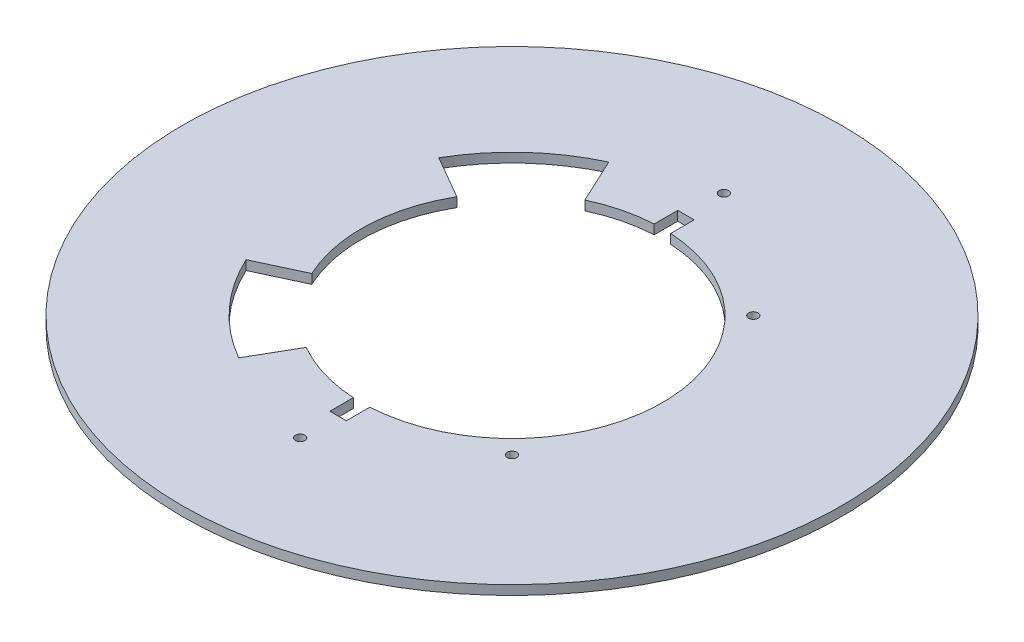
ISO-10303-21;
HEADER;
FILE_DESCRIPTION(('STEP AP214'),'2;1');
FILE_NAME('part.step','',(''),(''),'','','');
FILE_SCHEMA(('AUTOMOTIVE_DESIGN { 1 0 10303 214 1 1 1 1 }'));
ENDSEC;
DATA;
#1=APPLICATION_CONTEXT('core data for automotive mechanical design processes');
#2=APPLICATION_PROTOCOL_DEFINITION('international standard','automotive_design',2000,#1);
#3=PRODUCT_CONTEXT('',#1,'mechanical');
#4=PRODUCT('Part','Part','',(#3));
#5=PRODUCT_RELATED_PRODUCT_CATEGORY('part','',(#4));
#6=PRODUCT_DEFINITION_FORMATION('','',#4);
#7=PRODUCT_DEFINITION_CONTEXT('part definition',#1,'design');
#8=PRODUCT_DEFINITION('design','',#6,#7);
#9=PRODUCT_DEFINITION_SHAPE('','',#8);
#10=(LENGTH_UNIT() NAMED_UNIT(*) SI_UNIT(.MILLI.,.METRE.));
#11=(NAMED_UNIT(*) PLANE_ANGLE_UNIT() SI_UNIT($,.RADIAN.));
#12=(NAMED_UNIT(*) SI_UNIT($,.STERADIAN.) SOLID_ANGLE_UNIT());
#13=UNCERTAINTY_MEASURE_WITH_UNIT(LENGTH_MEASURE(1.E-05),#10,'distance_accuracy_value','');
#14=(GEOMETRIC_REPRESENTATION_CONTEXT(3) GLOBAL_UNCERTAINTY_ASSIGNED_CONTEXT((#13)) GLOBAL_UNIT_ASSIGNED_CONTEXT((#10,
#11,#12)) REPRESENTATION_CONTEXT('',''));
#15=CARTESIAN_POINT('',(0.,0.,0.));
#16=DIRECTION('',(0.,0.,1.));
#17=DIRECTION('',(1.,0.,0.));
#18=AXIS2_PLACEMENT_3D('',#15,#16,#17);
#19=CARTESIAN_POINT('',(0.,2.,0.));
#20=DIRECTION('',(0.,-1.,0.));
#21=DIRECTION('',(0.,0.,-1.));
#22=AXIS2_PLACEMENT_3D('',#19,#20,#21);
#23=CYLINDRICAL_SURFACE('',#22,64.);
#24=DIRECTION('',(0.,1.,0.));
#25=VECTOR('',#24,1.);
#26=CARTESIAN_POINT('',(-32.,-2.,55.4256258422041));
#27=LINE('',#26,#25);
#28=CARTESIAN_POINT('',(-32.,-2.,55.4256258422041));
#29=VERTEX_POINT('',#28);
#30=CARTESIAN_POINT('',(-32.,2.,55.4256258422041));
#31=VERTEX_POINT('',#30);
#32=EDGE_CURVE('E300',#29,#31,#27,.T.);
#33=ORIENTED_EDGE('',*,*,#32,.T.);
#34=CARTESIAN_POINT('',(0.,2.,0.));
#35=DIRECTION('',(0.,1.,0.));
#36=DIRECTION('',(0.,0.,1.));
#37=AXIS2_PLACEMENT_3D('',#34,#35,#36);
#38=CIRCLE('',#37,64.);
#39=CARTESIAN_POINT('',(-3.50000000000001,2.,63.9042252124224));
#40=VERTEX_POINT('',#39);
#41=EDGE_CURVE('E193',#31,#40,#38,.T.);
#42=ORIENTED_EDGE('',*,*,#41,.T.);
#43=DIRECTION('',(0.,1.,0.));
#44=VECTOR('',#43,1.);
#45=CARTESIAN_POINT('',(-3.50000000000001,-2.,63.9042252124224));
#46=LINE('',#45,#44);
#47=CARTESIAN_POINT('',(-3.50000000000001,-2.,63.9042252124224));
#48=VERTEX_POINT('',#47);
#49=EDGE_CURVE('E207',#48,#40,#46,.T.);
#50=ORIENTED_EDGE('',*,*,#49,.F.);
#51=CARTESIAN_POINT('',(0.,-2.,0.));
#52=DIRECTION('',(0.,1.,0.));
#53=DIRECTION('',(0.,0.,1.));
#54=AXIS2_PLACEMENT_3D('',#51,#52,#53);
#55=CIRCLE('',#54,64.);
#56=EDGE_CURVE('E183',#29,#48,#55,.T.);
#57=ORIENTED_EDGE('',*,*,#56,.F.);
#58=EDGE_LOOP('',(#33,#42,#50,#57));
#59=FACE_BOUND('',#58,.T.);
#60=ADVANCED_FACE('F41',(#59),#23,.F.);
#61=DIRECTION('',(0.,1.,0.));
#62=VECTOR('',#61,1.);
#63=CARTESIAN_POINT('',(-27.0475687514046,-2.,-58.0036983703457));
#64=LINE('',#63,#62);
#65=CARTESIAN_POINT('',(-27.0475687514046,-2.,-58.0036983703457));
#66=VERTEX_POINT('',#65);
#67=CARTESIAN_POINT('',(-27.0475687514046,2.,-58.0036983703457));
#68=VERTEX_POINT('',#67);
#69=EDGE_CURVE('E310',#66,#68,#64,.T.);
#70=ORIENTED_EDGE('',*,*,#69,.F.);
#71=CARTESIAN_POINT('',(-3.50000000000001,-2.,-63.9042252124224));
#72=VERTEX_POINT('',#71);
#73=EDGE_CURVE('E182',#72,#66,#55,.T.);
#74=ORIENTED_EDGE('',*,*,#73,.F.);
#75=DIRECTION('',(0.,1.,0.));
#76=VECTOR('',#75,1.);
#77=CARTESIAN_POINT('',(-3.50000000000001,-2.,-63.9042252124224));
#78=LINE('',#77,#76);
#79=CARTESIAN_POINT('',(-3.50000000000001,2.,-63.9042252124224));
#80=VERTEX_POINT('',#79);
#81=EDGE_CURVE('E238',#72,#80,#78,.T.);
#82=ORIENTED_EDGE('',*,*,#81,.T.);
#83=EDGE_CURVE('E198',#80,#68,#38,.T.);
#84=ORIENTED_EDGE('',*,*,#83,.T.);
#85=EDGE_LOOP('',(#70,#74,#82,#84));
#86=FACE_BOUND('',#85,.T.);
#87=ADVANCED_FACE('F396',(#86),#23,.F.);
#88=DIRECTION('',(0.,1.,0.));
#89=VECTOR('',#88,1.);
#90=CARTESIAN_POINT('',(-58.0036983703457,-2.,27.0475687514046));
#91=LINE('',#90,#89);
#92=CARTESIAN_POINT('',(-58.0036983703457,-2.,27.0475687514046));
#93=VERTEX_POINT('',#92);
#94=CARTESIAN_POINT('',(-58.0036983703457,2.,27.0475687514046));
#95=VERTEX_POINT('',#94);
#96=EDGE_CURVE('E159',#93,#95,#91,.T.);
#97=ORIENTED_EDGE('',*,*,#96,.F.);
#98=CARTESIAN_POINT('',(-55.4256258422041,-2.,-32.));
#99=VERTEX_POINT('',#98);
#100=EDGE_CURVE('E171',#99,#93,#55,.T.);
#101=ORIENTED_EDGE('',*,*,#100,.F.);
#102=DIRECTION('',(0.,1.,0.));
#103=VECTOR('',#102,1.);
#104=CARTESIAN_POINT('',(-55.4256258422041,-2.,-32.0000000000001));
#105=LINE('',#104,#103);
#106=CARTESIAN_POINT('',(-55.4256258422041,2.,-32.0000000000001));
#107=VERTEX_POINT('',#106);
#108=EDGE_CURVE('E65',#99,#107,#105,.T.);
#109=ORIENTED_EDGE('',*,*,#108,.T.);
#110=EDGE_CURVE('E173',#107,#95,#38,.T.);
#111=ORIENTED_EDGE('',*,*,#110,.T.);
#112=EDGE_LOOP('',(#97,#101,#109,#111));
#113=FACE_BOUND('',#112,.T.);
#114=ADVANCED_FACE('F170',(#113),#23,.F.);
#115=CARTESIAN_POINT('',(0.,2.,0.));
#116=DIRECTION('',(0.,1.,0.));
#117=DIRECTION('',(0.,0.,1.));
#118=AXIS2_PLACEMENT_3D('',#115,#116,#117);
#119=PLANE('',#118);
#120=DIRECTION('',(0.5,0.,-0.866025403784439));
#121=VECTOR('',#120,1.);
#122=CARTESIAN_POINT('',(-32.,2.,55.4256258422041));
#123=LINE('',#122,#121);
#124=CARTESIAN_POINT('',(-42.5,2.,73.6121593216773));
#125=VERTEX_POINT('',#124);
#126=EDGE_CURVE('E165',#125,#31,#123,.T.);
#127=ORIENTED_EDGE('',*,*,#126,.F.);
#128=CARTESIAN_POINT('',(1.09634523681734E-12,2.,-1.04777297948999E-12));
#129=DIRECTION('',(0.,1.,0.));
#130=DIRECTION('',(0.,0.,-1.));
#131=AXIS2_PLACEMENT_3D('',#128,#129,#130);
#132=CIRCLE('',#131,85.0000000000015);
#133=CARTESIAN_POINT('',(-77.0361618981153,2.,35.9225522479593));
#134=VERTEX_POINT('',#133);
#135=EDGE_CURVE('E346',#134,#125,#132,.T.);
#136=ORIENTED_EDGE('',*,*,#135,.F.);
#137=DIRECTION('',(-0.906307787036651,0.,0.422618261740698));
#138=VECTOR('',#137,1.);
#139=CARTESIAN_POINT('',(-58.0036983703457,2.,27.0475687514046));
#140=LINE('',#139,#138);
#141=EDGE_CURVE('E316',#95,#134,#140,.T.);
#142=ORIENTED_EDGE('',*,*,#141,.F.);
#143=ORIENTED_EDGE('',*,*,#110,.F.);
#144=DIRECTION('',(0.866025403784438,0.,0.5));
#145=VECTOR('',#144,1.);
#146=CARTESIAN_POINT('',(-55.4256258422041,2.,-32.));
#147=LINE('',#146,#145);
#148=CARTESIAN_POINT('',(-73.6121593216773,2.,-42.5));
#149=VERTEX_POINT('',#148);
#150=EDGE_CURVE('E322',#149,#107,#147,.T.);
#151=ORIENTED_EDGE('',*,*,#150,.F.);
#152=CARTESIAN_POINT('',(0.,2.,0.));
#153=DIRECTION('',(0.,1.,0.));
#154=DIRECTION('',(0.,0.,-1.));
#155=AXIS2_PLACEMENT_3D('',#152,#153,#154);
#156=CIRCLE('',#155,85.);
#157=CARTESIAN_POINT('',(-35.9225522479593,2.,-77.0361618981153));
#158=VERTEX_POINT('',#157);
#159=EDGE_CURVE('E325',#158,#149,#156,.T.);
#160=ORIENTED_EDGE('',*,*,#159,.F.);
#161=DIRECTION('',(-0.422618261740697,0.,-0.906307787036651));
#162=VECTOR('',#161,1.);
#163=CARTESIAN_POINT('',(-27.0475687514046,2.,-58.0036983703457));
#164=LINE('',#163,#162);
#165=EDGE_CURVE('E317',#68,#158,#164,.T.);
#166=ORIENTED_EDGE('',*,*,#165,.F.);
#167=ORIENTED_EDGE('',*,*,#83,.F.);
#168=DIRECTION('',(0.,0.,1.));
#169=VECTOR('',#168,1.);
#170=CARTESIAN_POINT('',(-3.5,2.,-73.9042252124224));
#171=LINE('',#170,#169);
#172=CARTESIAN_POINT('',(-3.5,2.,-73.9042252124224));
#173=VERTEX_POINT('',#172);
#174=EDGE_CURVE('E214',#173,#80,#171,.T.);
#175=ORIENTED_EDGE('',*,*,#174,.F.);
#176=DIRECTION('',(-1.,0.,0.));
#177=VECTOR('',#176,1.);
#178=CARTESIAN_POINT('',(-3.5,2.,-73.9042252124224));
#179=LINE('',#178,#177);
#180=CARTESIAN_POINT('',(3.5,2.,-73.9042252124224));
#181=VERTEX_POINT('',#180);
#182=EDGE_CURVE('E251',#181,#173,#179,.T.);
#183=ORIENTED_EDGE('',*,*,#182,.F.);
#184=DIRECTION('',(0.,0.,-1.));
#185=VECTOR('',#184,1.);
#186=CARTESIAN_POINT('',(3.5,2.,-73.9042252124224));
#187=LINE('',#186,#185);
#188=CARTESIAN_POINT('',(3.5,2.,-63.9042252124224));
#189=VERTEX_POINT('',#188);
#190=EDGE_CURVE('E256',#189,#181,#187,.T.);
#191=ORIENTED_EDGE('',*,*,#190,.F.);
#192=CARTESIAN_POINT('',(3.5,2.,63.9042252124224));
#193=VERTEX_POINT('',#192);
#194=EDGE_CURVE('E194',#193,#189,#38,.T.);
#195=ORIENTED_EDGE('',*,*,#194,.F.);
#196=DIRECTION('',(0.,0.,-1.));
#197=VECTOR('',#196,1.);
#198=CARTESIAN_POINT('',(3.5,2.,73.9042252124224));
#199=LINE('',#198,#197);
#200=CARTESIAN_POINT('',(3.5,2.,73.9042252124224));
#201=VERTEX_POINT('',#200);
#202=EDGE_CURVE('E220',#201,#193,#199,.T.);
#203=ORIENTED_EDGE('',*,*,#202,.F.);
#204=DIRECTION('',(1.,0.,0.));
#205=VECTOR('',#204,1.);
#206=CARTESIAN_POINT('',(0.,2.,73.9042252124224));
#207=LINE('',#206,#205);
#208=CARTESIAN_POINT('',(-3.5,2.,73.9042252124224));
#209=VERTEX_POINT('',#208);
#210=EDGE_CURVE('E223',#209,#201,#207,.T.);
#211=ORIENTED_EDGE('',*,*,#210,.F.);
#212=DIRECTION('',(0.,0.,1.));
#213=VECTOR('',#212,1.);
#214=CARTESIAN_POINT('',(-3.5,2.,73.9042252124224));
#215=LINE('',#214,#213);
#216=EDGE_CURVE('E215',#40,#209,#215,.T.);
#217=ORIENTED_EDGE('',*,*,#216,.F.);
#218=ORIENTED_EDGE('',*,*,#41,.F.);
#219=EDGE_LOOP('',(#127,#136,#142,#143,#151,#160,#166,#167,#175,#183,#191,#195,#203,#211,#217,#218));
#220=FACE_BOUND('',#219,.T.);
#221=CARTESIAN_POINT('',(51.2652416360241,2.,-51.2652416360252));
#222=DIRECTION('',(0.,1.,0.));
#223=DIRECTION('',(0.,0.,-1.));
#224=AXIS2_PLACEMENT_3D('',#221,#222,#223);
#225=CIRCLE('',#224,2.);
#226=CARTESIAN_POINT('',(51.2652416360241,2.,-53.2652416360252));
#227=VERTEX_POINT('',#226);
#228=EDGE_CURVE('E296',#227,#227,#225,.T.);
#229=ORIENTED_EDGE('',*,*,#228,.F.);
#230=EDGE_LOOP('',(#229));
#231=FACE_BOUND('',#230,.T.);
#232=CARTESIAN_POINT('',(0.,2.,90.));
#233=DIRECTION('',(0.,1.,0.));
#234=DIRECTION('',(0.,0.,1.));
#235=AXIS2_PLACEMENT_3D('',#232,#233,#234);
#236=CIRCLE('',#235,2.);
#237=CARTESIAN_POINT('',(0.,2.,92.));
#238=VERTEX_POINT('',#237);
#239=EDGE_CURVE('E289',#238,#238,#236,.T.);
#240=ORIENTED_EDGE('',*,*,#239,.F.);
#241=EDGE_LOOP('',(#240));
#242=FACE_BOUND('',#241,.T.);
#243=CARTESIAN_POINT('',(0.,2.,-90.));
#244=DIRECTION('',(0.,1.,0.));
#245=DIRECTION('',(0.,0.,-1.));
#246=AXIS2_PLACEMENT_3D('',#243,#244,#245);
#247=CIRCLE('',#246,2.);
#248=CARTESIAN_POINT('',(0.,2.,-92.));
#249=VERTEX_POINT('',#248);
#250=EDGE_CURVE('E280',#249,#249,#247,.T.);
#251=ORIENTED_EDGE('',*,*,#250,.F.);
#252=EDGE_LOOP('',(#251));
#253=FACE_BOUND('',#252,.T.);
#254=CARTESIAN_POINT('',(51.2652416360252,2.,51.2652416360241));
#255=DIRECTION('',(0.,1.,0.));
#256=DIRECTION('',(0.,0.,-1.));
#257=AXIS2_PLACEMENT_3D('',#254,#255,#256);
#258=CIRCLE('',#257,2.);
#259=CARTESIAN_POINT('',(51.2652416360252,2.,49.2652416360241));
#260=VERTEX_POINT('',#259);
#261=EDGE_CURVE('E272',#260,#260,#258,.T.);
#262=ORIENTED_EDGE('',*,*,#261,.F.);
#263=EDGE_LOOP('',(#262));
#264=FACE_BOUND('',#263,.T.);
#265=CARTESIAN_POINT('',(0.,2.,0.));
#266=DIRECTION('',(0.,1.,0.));
#267=DIRECTION('',(0.,0.,1.));
#268=AXIS2_PLACEMENT_3D('',#265,#266,#267);
#269=CIRCLE('',#268,140.);
#270=CARTESIAN_POINT('',(0.,2.,140.));
#271=VERTEX_POINT('',#270);
#272=EDGE_CURVE('E11',#271,#271,#269,.T.);
#273=ORIENTED_EDGE('',*,*,#272,.T.);
#274=EDGE_LOOP('',(#273));
#275=FACE_BOUND('',#274,.T.);
#276=ADVANCED_FACE('F369',(#220,#231,#242,#253,#264,#275),#119,.T.);
#277=CARTESIAN_POINT('',(0.,-2.,0.));
#278=DIRECTION('',(0.,1.,0.));
#279=DIRECTION('',(0.,0.,1.));
#280=AXIS2_PLACEMENT_3D('',#277,#278,#279);
#281=PLANE('',#280);
#282=CARTESIAN_POINT('',(51.2652416360241,-2.,-51.2652416360252));
#283=DIRECTION('',(0.,1.,0.));
#284=DIRECTION('',(0.,0.,-1.));
#285=AXIS2_PLACEMENT_3D('',#282,#283,#284);
#286=CIRCLE('',#285,2.);
#287=CARTESIAN_POINT('',(51.2652416360241,-2.,-53.2652416360252));
#288=VERTEX_POINT('',#287);
#289=EDGE_CURVE('E285',#288,#288,#286,.T.);
#290=ORIENTED_EDGE('',*,*,#289,.T.);
#291=EDGE_LOOP('',(#290));
#292=FACE_BOUND('',#291,.T.);
#293=CARTESIAN_POINT('',(0.,-2.,90.));
#294=DIRECTION('',(0.,1.,0.));
#295=DIRECTION('',(0.,0.,1.));
#296=AXIS2_PLACEMENT_3D('',#293,#294,#295);
#297=CIRCLE('',#296,2.);
#298=CARTESIAN_POINT('',(0.,-2.,92.));
#299=VERTEX_POINT('',#298);
#300=EDGE_CURVE('E276',#299,#299,#297,.T.);
#301=ORIENTED_EDGE('',*,*,#300,.T.);
#302=EDGE_LOOP('',(#301));
#303=FACE_BOUND('',#302,.T.);
#304=CARTESIAN_POINT('',(0.,-2.,-90.));
#305=DIRECTION('',(0.,1.,0.));
#306=DIRECTION('',(0.,0.,-1.));
#307=AXIS2_PLACEMENT_3D('',#304,#305,#306);
#308=CIRCLE('',#307,2.);
#309=CARTESIAN_POINT('',(0.,-2.,-92.));
#310=VERTEX_POINT('',#309);
#311=EDGE_CURVE('E284',#310,#310,#308,.T.);
#312=ORIENTED_EDGE('',*,*,#311,.T.);
#313=EDGE_LOOP('',(#312));
#314=FACE_BOUND('',#313,.T.);
#315=CARTESIAN_POINT('',(51.2652416360252,-2.,51.2652416360241));
#316=DIRECTION('',(0.,1.,0.));
#317=DIRECTION('',(0.,0.,-1.));
#318=AXIS2_PLACEMENT_3D('',#315,#316,#317);
#319=CIRCLE('',#318,2.);
#320=CARTESIAN_POINT('',(51.2652416360252,-2.,49.2652416360241));
#321=VERTEX_POINT('',#320);
#322=EDGE_CURVE('E227',#321,#321,#319,.T.);
#323=ORIENTED_EDGE('',*,*,#322,.T.);
#324=EDGE_LOOP('',(#323));
#325=FACE_BOUND('',#324,.T.);
#326=CARTESIAN_POINT('',(1.09634523681734E-12,-2.,-1.04777297948999E-12));
#327=DIRECTION('',(0.,1.,0.));
#328=DIRECTION('',(0.,0.,-1.));
#329=AXIS2_PLACEMENT_3D('',#326,#327,#328);
#330=CIRCLE('',#329,85.0000000000015);
#331=CARTESIAN_POINT('',(-77.0361618981153,-2.,35.9225522479593));
#332=VERTEX_POINT('',#331);
#333=CARTESIAN_POINT('',(-42.5,-2.,73.6121593216773));
#334=VERTEX_POINT('',#333);
#335=EDGE_CURVE('E57',#332,#334,#330,.T.);
#336=ORIENTED_EDGE('',*,*,#335,.T.);
#337=DIRECTION('',(0.5,0.,-0.866025403784439));
#338=VECTOR('',#337,1.);
#339=CARTESIAN_POINT('',(-32.,-2.,55.4256258422041));
#340=LINE('',#339,#338);
#341=EDGE_CURVE('E175',#334,#29,#340,.T.);
#342=ORIENTED_EDGE('',*,*,#341,.T.);
#343=ORIENTED_EDGE('',*,*,#56,.T.);
#344=DIRECTION('',(0.,0.,1.));
#345=VECTOR('',#344,1.);
#346=CARTESIAN_POINT('',(-3.5,-2.,73.9042252124224));
#347=LINE('',#346,#345);
#348=CARTESIAN_POINT('',(-3.5,-2.,73.9042252124224));
#349=VERTEX_POINT('',#348);
#350=EDGE_CURVE('E203',#48,#349,#347,.T.);
#351=ORIENTED_EDGE('',*,*,#350,.T.);
#352=DIRECTION('',(1.,0.,0.));
#353=VECTOR('',#352,1.);
#354=CARTESIAN_POINT('',(-3.5,-2.,73.9042252124224));
#355=LINE('',#354,#353);
#356=CARTESIAN_POINT('',(3.5,-2.,73.9042252124224));
#357=VERTEX_POINT('',#356);
#358=EDGE_CURVE('E219',#349,#357,#355,.T.);
#359=ORIENTED_EDGE('',*,*,#358,.T.);
#360=DIRECTION('',(0.,0.,-1.));
#361=VECTOR('',#360,1.);
#362=CARTESIAN_POINT('',(3.5,-2.,73.9042252124224));
#363=LINE('',#362,#361);
#364=CARTESIAN_POINT('',(3.5,-2.,63.9042252124224));
#365=VERTEX_POINT('',#364);
#366=EDGE_CURVE('E231',#357,#365,#363,.T.);
#367=ORIENTED_EDGE('',*,*,#366,.T.);
#368=CARTESIAN_POINT('',(3.5,-2.,-63.9042252124224));
#369=VERTEX_POINT('',#368);
#370=EDGE_CURVE('E188',#365,#369,#55,.T.);
#371=ORIENTED_EDGE('',*,*,#370,.T.);
#372=DIRECTION('',(0.,0.,-1.));
#373=VECTOR('',#372,1.);
#374=CARTESIAN_POINT('',(3.5,-2.,-73.9042252124224));
#375=LINE('',#374,#373);
#376=CARTESIAN_POINT('',(3.5,-2.,-73.9042252124224));
#377=VERTEX_POINT('',#376);
#378=EDGE_CURVE('E265',#369,#377,#375,.T.);
#379=ORIENTED_EDGE('',*,*,#378,.T.);
#380=DIRECTION('',(-1.,0.,0.));
#381=VECTOR('',#380,1.);
#382=CARTESIAN_POINT('',(0.,-2.,-73.9042252124224));
#383=LINE('',#382,#381);
#384=CARTESIAN_POINT('',(-3.5,-2.,-73.9042252124224));
#385=VERTEX_POINT('',#384);
#386=EDGE_CURVE('E243',#377,#385,#383,.T.);
#387=ORIENTED_EDGE('',*,*,#386,.T.);
#388=DIRECTION('',(0.,0.,1.));
#389=VECTOR('',#388,1.);
#390=CARTESIAN_POINT('',(-3.5,-2.,-73.9042252124224));
#391=LINE('',#390,#389);
#392=EDGE_CURVE('E255',#385,#72,#391,.T.);
#393=ORIENTED_EDGE('',*,*,#392,.T.);
#394=ORIENTED_EDGE('',*,*,#73,.T.);
#395=DIRECTION('',(-0.422618261740697,0.,-0.906307787036651));
#396=VECTOR('',#395,1.);
#397=CARTESIAN_POINT('',(-27.0475687514046,-2.,-58.0036983703457));
#398=LINE('',#397,#396);
#399=CARTESIAN_POINT('',(-35.9225522479593,-2.,-77.0361618981153));
#400=VERTEX_POINT('',#399);
#401=EDGE_CURVE('E307',#66,#400,#398,.T.);
#402=ORIENTED_EDGE('',*,*,#401,.T.);
#403=CARTESIAN_POINT('',(0.,-2.,0.));
#404=DIRECTION('',(0.,1.,0.));
#405=DIRECTION('',(0.,0.,-1.));
#406=AXIS2_PLACEMENT_3D('',#403,#404,#405);
#407=CIRCLE('',#406,85.);
#408=CARTESIAN_POINT('',(-73.6121593216773,-2.,-42.5));
#409=VERTEX_POINT('',#408);
#410=EDGE_CURVE('E321',#400,#409,#407,.T.);
#411=ORIENTED_EDGE('',*,*,#410,.T.);
#412=DIRECTION('',(0.866025403784438,0.,0.5));
#413=VECTOR('',#412,1.);
#414=CARTESIAN_POINT('',(-55.4256258422041,-2.,-32.));
#415=LINE('',#414,#413);
#416=EDGE_CURVE('E180',#409,#99,#415,.T.);
#417=ORIENTED_EDGE('',*,*,#416,.T.);
#418=ORIENTED_EDGE('',*,*,#100,.T.);
#419=DIRECTION('',(-0.906307787036651,0.,0.422618261740698));
#420=VECTOR('',#419,1.);
#421=CARTESIAN_POINT('',(-58.0036983703457,-2.,27.0475687514046));
#422=LINE('',#421,#420);
#423=EDGE_CURVE('E155',#93,#332,#422,.T.);
#424=ORIENTED_EDGE('',*,*,#423,.T.);
#425=EDGE_LOOP('',(#336,#342,#343,#351,#359,#367,#371,#379,#387,#393,#394,#402,#411,#417,#418,#424));
#426=FACE_BOUND('',#425,.T.);
#427=CARTESIAN_POINT('',(0.,-2.,0.));
#428=DIRECTION('',(0.,1.,0.));
#429=DIRECTION('',(0.,0.,1.));
#430=AXIS2_PLACEMENT_3D('',#427,#428,#429);
#431=CIRCLE('',#430,140.);
#432=CARTESIAN_POINT('',(0.,-2.,140.));
#433=VERTEX_POINT('',#432);
#434=EDGE_CURVE('E45',#433,#433,#431,.T.);
#435=ORIENTED_EDGE('',*,*,#434,.F.);
#436=EDGE_LOOP('',(#435));
#437=FACE_BOUND('',#436,.T.);
#438=ADVANCED_FACE('F177',(#292,#303,#314,#325,#426,#437),#281,.F.);
#439=CARTESIAN_POINT('',(0.,2.,0.));
#440=DIRECTION('',(0.,-1.,0.));
#441=DIRECTION('',(0.,0.,-1.));
#442=AXIS2_PLACEMENT_3D('',#439,#440,#441);
#443=CYLINDRICAL_SURFACE('',#442,140.);
#444=ORIENTED_EDGE('',*,*,#272,.F.);
#445=EDGE_LOOP('',(#444));
#446=FACE_BOUND('',#445,.T.);
#447=ORIENTED_EDGE('',*,*,#434,.T.);
#448=EDGE_LOOP('',(#447));
#449=FACE_BOUND('',#448,.T.);
#450=ADVANCED_FACE('F43',(#446,#449),#443,.T.);
#451=DIRECTION('',(0.,1.,0.));
#452=VECTOR('',#451,1.);
#453=CARTESIAN_POINT('',(3.5,-2.,-63.9042252124224));
#454=LINE('',#453,#452);
#455=EDGE_CURVE('E242',#369,#189,#454,.T.);
#456=ORIENTED_EDGE('',*,*,#455,.F.);
#457=ORIENTED_EDGE('',*,*,#370,.F.);
#458=DIRECTION('',(0.,1.,0.));
#459=VECTOR('',#458,1.);
#460=CARTESIAN_POINT('',(3.5,-2.,63.9042252124224));
#461=LINE('',#460,#459);
#462=EDGE_CURVE('E202',#365,#193,#461,.T.);
#463=ORIENTED_EDGE('',*,*,#462,.T.);
#464=ORIENTED_EDGE('',*,*,#194,.T.);
#465=EDGE_LOOP('',(#456,#457,#463,#464));
#466=FACE_BOUND('',#465,.T.);
#467=ADVANCED_FACE('F381',(#466),#23,.F.);
#468=CARTESIAN_POINT('',(-3.5,-2.,73.9042252124224));
#469=DIRECTION('',(-1.,0.,0.));
#470=DIRECTION('',(0.,0.,1.));
#471=AXIS2_PLACEMENT_3D('',#468,#469,#470);
#472=PLANE('',#471);
#473=ORIENTED_EDGE('',*,*,#216,.T.);
#474=DIRECTION('',(0.,1.,0.));
#475=VECTOR('',#474,1.);
#476=CARTESIAN_POINT('',(-3.5,-2.,73.9042252124224));
#477=LINE('',#476,#475);
#478=EDGE_CURVE('E211',#349,#209,#477,.T.);
#479=ORIENTED_EDGE('',*,*,#478,.F.);
#480=ORIENTED_EDGE('',*,*,#350,.F.);
#481=ORIENTED_EDGE('',*,*,#49,.T.);
#482=EDGE_LOOP('',(#473,#479,#480,#481));
#483=FACE_BOUND('',#482,.T.);
#484=ADVANCED_FACE('F365',(#483),#472,.F.);
#485=CARTESIAN_POINT('',(3.5,-2.,73.9042252124224));
#486=DIRECTION('',(1.,0.,0.));
#487=DIRECTION('',(0.,0.,-1.));
#488=AXIS2_PLACEMENT_3D('',#485,#486,#487);
#489=PLANE('',#488);
#490=ORIENTED_EDGE('',*,*,#202,.T.);
#491=ORIENTED_EDGE('',*,*,#462,.F.);
#492=ORIENTED_EDGE('',*,*,#366,.F.);
#493=DIRECTION('',(0.,1.,0.));
#494=VECTOR('',#493,1.);
#495=CARTESIAN_POINT('',(3.5,-2.,73.9042252124224));
#496=LINE('',#495,#494);
#497=EDGE_CURVE('E199',#357,#201,#496,.T.);
#498=ORIENTED_EDGE('',*,*,#497,.T.);
#499=EDGE_LOOP('',(#490,#491,#492,#498));
#500=FACE_BOUND('',#499,.T.);
#501=ADVANCED_FACE('F430',(#500),#489,.F.);
#502=CARTESIAN_POINT('',(0.,-2.,73.9042252124224));
#503=DIRECTION('',(0.,0.,1.));
#504=DIRECTION('',(1.,0.,0.));
#505=AXIS2_PLACEMENT_3D('',#502,#503,#504);
#506=PLANE('',#505);
#507=ORIENTED_EDGE('',*,*,#210,.T.);
#508=ORIENTED_EDGE('',*,*,#497,.F.);
#509=ORIENTED_EDGE('',*,*,#358,.F.);
#510=ORIENTED_EDGE('',*,*,#478,.T.);
#511=EDGE_LOOP('',(#507,#508,#509,#510));
#512=FACE_BOUND('',#511,.T.);
#513=ADVANCED_FACE('F374',(#512),#506,.F.);
#514=CARTESIAN_POINT('',(-3.5,-2.,-73.9042252124224));
#515=DIRECTION('',(-1.,0.,0.));
#516=DIRECTION('',(0.,0.,1.));
#517=AXIS2_PLACEMENT_3D('',#514,#515,#516);
#518=PLANE('',#517);
#519=ORIENTED_EDGE('',*,*,#174,.T.);
#520=ORIENTED_EDGE('',*,*,#81,.F.);
#521=ORIENTED_EDGE('',*,*,#392,.F.);
#522=DIRECTION('',(0.,1.,0.));
#523=VECTOR('',#522,1.);
#524=CARTESIAN_POINT('',(-3.5,-2.,-73.9042252124224));
#525=LINE('',#524,#523);
#526=EDGE_CURVE('E189',#385,#173,#525,.T.);
#527=ORIENTED_EDGE('',*,*,#526,.T.);
#528=EDGE_LOOP('',(#519,#520,#521,#527));
#529=FACE_BOUND('',#528,.T.);
#530=ADVANCED_FACE('F478',(#529),#518,.F.);
#531=CARTESIAN_POINT('',(-3.5,-2.,-73.9042252124224));
#532=DIRECTION('',(0.,0.,-1.));
#533=DIRECTION('',(-1.,0.,0.));
#534=AXIS2_PLACEMENT_3D('',#531,#532,#533);
#535=PLANE('',#534);
#536=ORIENTED_EDGE('',*,*,#182,.T.);
#537=ORIENTED_EDGE('',*,*,#526,.F.);
#538=ORIENTED_EDGE('',*,*,#386,.F.);
#539=DIRECTION('',(0.,1.,0.));
#540=VECTOR('',#539,1.);
#541=CARTESIAN_POINT('',(3.5,-2.,-73.9042252124224));
#542=LINE('',#541,#540);
#543=EDGE_CURVE('E246',#377,#181,#542,.T.);
#544=ORIENTED_EDGE('',*,*,#543,.T.);
#545=EDGE_LOOP('',(#536,#537,#538,#544));
#546=FACE_BOUND('',#545,.T.);
#547=ADVANCED_FACE('F389',(#546),#535,.F.);
#548=CARTESIAN_POINT('',(3.5,-2.,-73.9042252124224));
#549=DIRECTION('',(1.,0.,0.));
#550=DIRECTION('',(0.,0.,-1.));
#551=AXIS2_PLACEMENT_3D('',#548,#549,#550);
#552=PLANE('',#551);
#553=ORIENTED_EDGE('',*,*,#190,.T.);
#554=ORIENTED_EDGE('',*,*,#543,.F.);
#555=ORIENTED_EDGE('',*,*,#378,.F.);
#556=ORIENTED_EDGE('',*,*,#455,.T.);
#557=EDGE_LOOP('',(#553,#554,#555,#556));
#558=FACE_BOUND('',#557,.T.);
#559=ADVANCED_FACE('F384',(#558),#552,.F.);
#560=CARTESIAN_POINT('',(51.2652416360252,-2.,51.2652416360241));
#561=DIRECTION('',(0.,1.,0.));
#562=DIRECTION('',(0.,0.,1.));
#563=AXIS2_PLACEMENT_3D('',#560,#561,#562);
#564=CYLINDRICAL_SURFACE('',#563,2.);
#565=ORIENTED_EDGE('',*,*,#322,.F.);
#566=EDGE_LOOP('',(#565));
#567=FACE_BOUND('',#566,.T.);
#568=ORIENTED_EDGE('',*,*,#261,.T.);
#569=EDGE_LOOP('',(#568));
#570=FACE_BOUND('',#569,.T.);
#571=ADVANCED_FACE('F451',(#567,#570),#564,.F.);
#572=CARTESIAN_POINT('',(0.,-2.,-90.));
#573=DIRECTION('',(0.,1.,0.));
#574=DIRECTION('',(0.,0.,1.));
#575=AXIS2_PLACEMENT_3D('',#572,#573,#574);
#576=CYLINDRICAL_SURFACE('',#575,2.);
#577=ORIENTED_EDGE('',*,*,#311,.F.);
#578=EDGE_LOOP('',(#577));
#579=FACE_BOUND('',#578,.T.);
#580=ORIENTED_EDGE('',*,*,#250,.T.);
#581=EDGE_LOOP('',(#580));
#582=FACE_BOUND('',#581,.T.);
#583=ADVANCED_FACE('F454',(#579,#582),#576,.F.);
#584=CARTESIAN_POINT('',(0.,-2.,90.));
#585=DIRECTION('',(0.,1.,0.));
#586=DIRECTION('',(0.,0.,1.));
#587=AXIS2_PLACEMENT_3D('',#584,#585,#586);
#588=CYLINDRICAL_SURFACE('',#587,2.);
#589=ORIENTED_EDGE('',*,*,#300,.F.);
#590=EDGE_LOOP('',(#589));
#591=FACE_BOUND('',#590,.T.);
#592=ORIENTED_EDGE('',*,*,#239,.T.);
#593=EDGE_LOOP('',(#592));
#594=FACE_BOUND('',#593,.T.);
#595=ADVANCED_FACE('F471',(#591,#594),#588,.F.);
#596=CARTESIAN_POINT('',(51.2652416360241,-2.,-51.2652416360252));
#597=DIRECTION('',(0.,1.,0.));
#598=DIRECTION('',(0.,0.,1.));
#599=AXIS2_PLACEMENT_3D('',#596,#597,#598);
#600=CYLINDRICAL_SURFACE('',#599,2.);
#601=ORIENTED_EDGE('',*,*,#289,.F.);
#602=EDGE_LOOP('',(#601));
#603=FACE_BOUND('',#602,.T.);
#604=ORIENTED_EDGE('',*,*,#228,.T.);
#605=EDGE_LOOP('',(#604));
#606=FACE_BOUND('',#605,.T.);
#607=ADVANCED_FACE('F519',(#603,#606),#600,.F.);
#608=CARTESIAN_POINT('',(0.,-2.,0.));
#609=DIRECTION('',(0.,1.,0.));
#610=DIRECTION('',(0.,0.,1.));
#611=AXIS2_PLACEMENT_3D('',#608,#609,#610);
#612=CYLINDRICAL_SURFACE('',#611,85.);
#613=ORIENTED_EDGE('',*,*,#159,.T.);
#614=DIRECTION('',(0.,1.,0.));
#615=VECTOR('',#614,1.);
#616=CARTESIAN_POINT('',(-73.6121593216773,-2.,-42.5));
#617=LINE('',#616,#615);
#618=EDGE_CURVE('E304',#409,#149,#617,.T.);
#619=ORIENTED_EDGE('',*,*,#618,.F.);
#620=ORIENTED_EDGE('',*,*,#410,.F.);
#621=DIRECTION('',(0.,1.,0.));
#622=VECTOR('',#621,1.);
#623=CARTESIAN_POINT('',(-35.9225522479593,-2.,-77.0361618981153));
#624=LINE('',#623,#622);
#625=EDGE_CURVE('E313',#400,#158,#624,.T.);
#626=ORIENTED_EDGE('',*,*,#625,.T.);
#627=EDGE_LOOP('',(#613,#619,#620,#626));
#628=FACE_BOUND('',#627,.T.);
#629=ADVANCED_FACE('F404',(#628),#612,.F.);
#630=CARTESIAN_POINT('',(-27.0475687514046,-2.,-58.0036983703457));
#631=DIRECTION('',(0.906307787036651,0.,-0.422618261740697));
#632=DIRECTION('',(-0.422618261740697,0.,-0.906307787036651));
#633=AXIS2_PLACEMENT_3D('',#630,#631,#632);
#634=PLANE('',#633);
#635=ORIENTED_EDGE('',*,*,#165,.T.);
#636=ORIENTED_EDGE('',*,*,#625,.F.);
#637=ORIENTED_EDGE('',*,*,#401,.F.);
#638=ORIENTED_EDGE('',*,*,#69,.T.);
#639=EDGE_LOOP('',(#635,#636,#637,#638));
#640=FACE_BOUND('',#639,.T.);
#641=ADVANCED_FACE('F400',(#640),#634,.F.);
#642=CARTESIAN_POINT('',(-55.4256258422041,-2.,-32.));
#643=DIRECTION('',(-0.5,0.,0.866025403784438));
#644=DIRECTION('',(0.866025403784439,0.,0.5));
#645=AXIS2_PLACEMENT_3D('',#642,#643,#644);
#646=PLANE('',#645);
#647=ORIENTED_EDGE('',*,*,#150,.T.);
#648=ORIENTED_EDGE('',*,*,#108,.F.);
#649=ORIENTED_EDGE('',*,*,#416,.F.);
#650=ORIENTED_EDGE('',*,*,#618,.T.);
#651=EDGE_LOOP('',(#647,#648,#649,#650));
#652=FACE_BOUND('',#651,.T.);
#653=ADVANCED_FACE('F406',(#652),#646,.F.);
#654=CARTESIAN_POINT('',(-32.,-2.,55.4256258422041));
#655=DIRECTION('',(0.866025403784439,0.,0.5));
#656=DIRECTION('',(0.5,0.,-0.866025403784439));
#657=AXIS2_PLACEMENT_3D('',#654,#655,#656);
#658=PLANE('',#657);
#659=ORIENTED_EDGE('',*,*,#126,.T.);
#660=ORIENTED_EDGE('',*,*,#32,.F.);
#661=ORIENTED_EDGE('',*,*,#341,.F.);
#662=DIRECTION('',(0.,1.,0.));
#663=VECTOR('',#662,1.);
#664=CARTESIAN_POINT('',(-42.5,-2.,73.6121593216773));
#665=LINE('',#664,#663);
#666=EDGE_CURVE('E338',#334,#125,#665,.T.);
#667=ORIENTED_EDGE('',*,*,#666,.T.);
#668=EDGE_LOOP('',(#659,#660,#661,#667));
#669=FACE_BOUND('',#668,.T.);
#670=ADVANCED_FACE('F408',(#669),#658,.F.);
#671=CARTESIAN_POINT('',(1.09634523681734E-12,-2.,-1.04777297948999E-12));
#672=DIRECTION('',(0.,1.,0.));
#673=DIRECTION('',(0.,0.,1.));
#674=AXIS2_PLACEMENT_3D('',#671,#672,#673);
#675=CYLINDRICAL_SURFACE('',#674,85.0000000000015);
#676=ORIENTED_EDGE('',*,*,#135,.T.);
#677=ORIENTED_EDGE('',*,*,#666,.F.);
#678=ORIENTED_EDGE('',*,*,#335,.F.);
#679=DIRECTION('',(0.,1.,0.));
#680=VECTOR('',#679,1.);
#681=CARTESIAN_POINT('',(-77.0361618981153,-2.,35.9225522479593));
#682=LINE('',#681,#680);
#683=EDGE_CURVE('E161',#332,#134,#682,.T.);
#684=ORIENTED_EDGE('',*,*,#683,.T.);
#685=EDGE_LOOP('',(#676,#677,#678,#684));
#686=FACE_BOUND('',#685,.T.);
#687=ADVANCED_FACE('F414',(#686),#675,.F.);
#688=CARTESIAN_POINT('',(-58.0036983703457,-2.,27.0475687514046));
#689=DIRECTION('',(-0.422618261740697,0.,-0.906307787036651));
#690=DIRECTION('',(-0.906307787036651,0.,0.422618261740698));
#691=AXIS2_PLACEMENT_3D('',#688,#689,#690);
#692=PLANE('',#691);
#693=ORIENTED_EDGE('',*,*,#141,.T.);
#694=ORIENTED_EDGE('',*,*,#683,.F.);
#695=ORIENTED_EDGE('',*,*,#423,.F.);
#696=ORIENTED_EDGE('',*,*,#96,.T.);
#697=EDGE_LOOP('',(#693,#694,#695,#696));
#698=FACE_BOUND('',#697,.T.);
#699=ADVANCED_FACE('F158',(#698),#692,.F.);
#700=CLOSED_SHELL('',(#60,#87,#114,#276,#438,#450,#467,#484,#501,#513,#530,#547,#559,#571,#583,
#595,#607,#629,#641,#653,#670,#687,#699));
#701=MANIFOLD_SOLID_BREP('B2',#700);
#702=ADVANCED_BREP_SHAPE_REPRESENTATION('',(#18,#701),#14);
#703=SHAPE_DEFINITION_REPRESENTATION(#9,#702);
ENDSEC;
END-ISO-10303-21;
